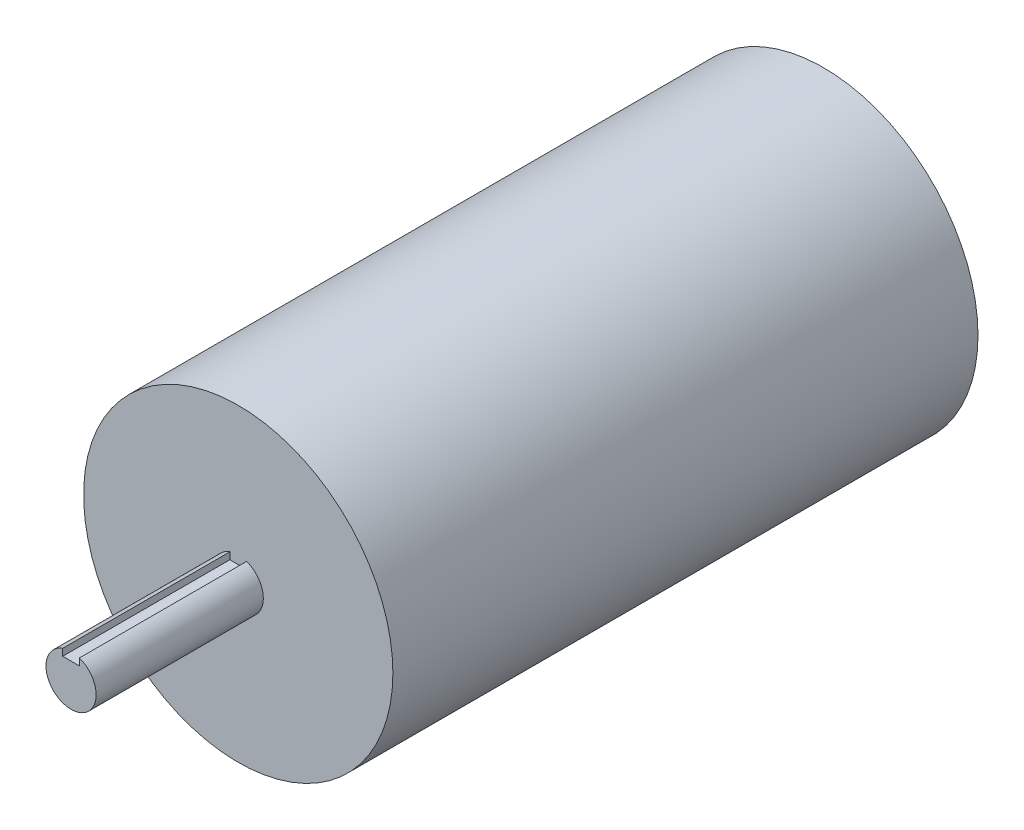
ISO-10303-21;
HEADER;
FILE_DESCRIPTION(('STEP AP214'),'2;1');
FILE_NAME('part.step','',(''),(''),'','','');
FILE_SCHEMA(('AUTOMOTIVE_DESIGN { 1 0 10303 214 1 1 1 1 }'));
ENDSEC;
DATA;
#1=APPLICATION_CONTEXT('core data for automotive mechanical design processes');
#2=APPLICATION_PROTOCOL_DEFINITION('international standard','automotive_design',2000,#1);
#3=PRODUCT_CONTEXT('',#1,'mechanical');
#4=PRODUCT('Part','Part','',(#3));
#5=PRODUCT_RELATED_PRODUCT_CATEGORY('part','',(#4));
#6=PRODUCT_DEFINITION_FORMATION('','',#4);
#7=PRODUCT_DEFINITION_CONTEXT('part definition',#1,'design');
#8=PRODUCT_DEFINITION('design','',#6,#7);
#9=PRODUCT_DEFINITION_SHAPE('','',#8);
#10=(LENGTH_UNIT() NAMED_UNIT(*) SI_UNIT(.MILLI.,.METRE.));
#11=(NAMED_UNIT(*) PLANE_ANGLE_UNIT() SI_UNIT($,.RADIAN.));
#12=(NAMED_UNIT(*) SI_UNIT($,.STERADIAN.) SOLID_ANGLE_UNIT());
#13=UNCERTAINTY_MEASURE_WITH_UNIT(LENGTH_MEASURE(1.E-05),#10,'distance_accuracy_value','');
#14=(GEOMETRIC_REPRESENTATION_CONTEXT(3) GLOBAL_UNCERTAINTY_ASSIGNED_CONTEXT((#13)) GLOBAL_UNIT_ASSIGNED_CONTEXT((#10,
#11,#12)) REPRESENTATION_CONTEXT('',''));
#15=CARTESIAN_POINT('',(0.,0.,0.));
#16=DIRECTION('',(0.,0.,1.));
#17=DIRECTION('',(1.,0.,0.));
#18=AXIS2_PLACEMENT_3D('',#15,#16,#17);
#19=CARTESIAN_POINT('',(0.,0.,35.));
#20=DIRECTION('',(0.,0.,-1.));
#21=DIRECTION('',(-1.,0.,0.));
#22=AXIS2_PLACEMENT_3D('',#19,#20,#21);
#23=CYLINDRICAL_SURFACE('',#22,18.5);
#24=CARTESIAN_POINT('',(0.,0.,35.));
#25=DIRECTION('',(0.,0.,1.));
#26=DIRECTION('',(1.,0.,0.));
#27=AXIS2_PLACEMENT_3D('',#24,#25,#26);
#28=CIRCLE('',#27,18.5);
#29=CARTESIAN_POINT('',(18.5,0.,35.));
#30=VERTEX_POINT('',#29);
#31=EDGE_CURVE('E11',#30,#30,#28,.T.);
#32=ORIENTED_EDGE('',*,*,#31,.F.);
#33=EDGE_LOOP('',(#32));
#34=FACE_BOUND('',#33,.T.);
#35=CARTESIAN_POINT('',(0.,0.,-35.));
#36=DIRECTION('',(0.,0.,1.));
#37=DIRECTION('',(1.,0.,0.));
#38=AXIS2_PLACEMENT_3D('',#35,#36,#37);
#39=CIRCLE('',#38,18.5);
#40=CARTESIAN_POINT('',(18.5,0.,-35.));
#41=VERTEX_POINT('',#40);
#42=EDGE_CURVE('E51',#41,#41,#39,.T.);
#43=ORIENTED_EDGE('',*,*,#42,.T.);
#44=EDGE_LOOP('',(#43));
#45=FACE_BOUND('',#44,.T.);
#46=ADVANCED_FACE('F50',(#34,#45),#23,.T.);
#47=CARTESIAN_POINT('',(0.,0.,35.));
#48=DIRECTION('',(0.,0.,1.));
#49=DIRECTION('',(1.,0.,0.));
#50=AXIS2_PLACEMENT_3D('',#47,#48,#49);
#51=PLANE('',#50);
#52=CARTESIAN_POINT('',(0.,0.,35.));
#53=DIRECTION('',(0.,0.,1.));
#54=DIRECTION('',(-1.,0.,0.));
#55=AXIS2_PLACEMENT_3D('',#52,#53,#54);
#56=CIRCLE('',#55,3.);
#57=CARTESIAN_POINT('',(-1.,2.82842712474619,35.));
#58=VERTEX_POINT('',#57);
#59=CARTESIAN_POINT('',(1.,2.82842712474619,35.));
#60=VERTEX_POINT('',#59);
#61=EDGE_CURVE('E65',#58,#60,#56,.T.);
#62=ORIENTED_EDGE('',*,*,#61,.F.);
#63=DIRECTION('',(0.,1.,0.));
#64=VECTOR('',#63,1.);
#65=CARTESIAN_POINT('',(-1.,2.82842712474619,35.));
#66=LINE('',#65,#64);
#67=CARTESIAN_POINT('',(-1.,2.,35.));
#68=VERTEX_POINT('',#67);
#69=EDGE_CURVE('E69',#68,#58,#66,.T.);
#70=ORIENTED_EDGE('',*,*,#69,.F.);
#71=DIRECTION('',(-1.,0.,0.));
#72=VECTOR('',#71,1.);
#73=CARTESIAN_POINT('',(-1.,2.,35.));
#74=LINE('',#73,#72);
#75=CARTESIAN_POINT('',(1.,2.,35.));
#76=VERTEX_POINT('',#75);
#77=EDGE_CURVE('E117',#76,#68,#74,.T.);
#78=ORIENTED_EDGE('',*,*,#77,.F.);
#79=DIRECTION('',(0.,-1.,0.));
#80=VECTOR('',#79,1.);
#81=CARTESIAN_POINT('',(1.,2.,35.));
#82=LINE('',#81,#80);
#83=EDGE_CURVE('E119',#60,#76,#82,.T.);
#84=ORIENTED_EDGE('',*,*,#83,.F.);
#85=EDGE_LOOP('',(#62,#70,#78,#84));
#86=FACE_BOUND('',#85,.T.);
#87=ORIENTED_EDGE('',*,*,#31,.T.);
#88=EDGE_LOOP('',(#87));
#89=FACE_BOUND('',#88,.T.);
#90=ADVANCED_FACE('F138',(#86,#89),#51,.T.);
#91=CARTESIAN_POINT('',(0.,0.,-35.));
#92=DIRECTION('',(0.,0.,1.));
#93=DIRECTION('',(1.,0.,0.));
#94=AXIS2_PLACEMENT_3D('',#91,#92,#93);
#95=PLANE('',#94);
#96=ORIENTED_EDGE('',*,*,#42,.F.);
#97=EDGE_LOOP('',(#96));
#98=FACE_BOUND('',#97,.T.);
#99=ADVANCED_FACE('F145',(#98),#95,.F.);
#100=CARTESIAN_POINT('',(0.,0.,55.));
#101=DIRECTION('',(0.,0.,-1.));
#102=DIRECTION('',(-1.,0.,0.));
#103=AXIS2_PLACEMENT_3D('',#100,#101,#102);
#104=CYLINDRICAL_SURFACE('',#103,3.);
#105=ORIENTED_EDGE('',*,*,#61,.T.);
#106=DIRECTION('',(0.,0.,-1.));
#107=VECTOR('',#106,1.);
#108=CARTESIAN_POINT('',(1.,2.82842712474619,55.));
#109=LINE('',#108,#107);
#110=CARTESIAN_POINT('',(1.,2.82842712474619,55.));
#111=VERTEX_POINT('',#110);
#112=EDGE_CURVE('E91',#111,#60,#109,.T.);
#113=ORIENTED_EDGE('',*,*,#112,.F.);
#114=CARTESIAN_POINT('',(0.,0.,55.));
#115=DIRECTION('',(0.,0.,1.));
#116=DIRECTION('',(-1.,0.,0.));
#117=AXIS2_PLACEMENT_3D('',#114,#115,#116);
#118=CIRCLE('',#117,3.);
#119=CARTESIAN_POINT('',(-1.,2.82842712474619,55.));
#120=VERTEX_POINT('',#119);
#121=EDGE_CURVE('E97',#120,#111,#118,.T.);
#122=ORIENTED_EDGE('',*,*,#121,.F.);
#123=DIRECTION('',(0.,0.,-1.));
#124=VECTOR('',#123,1.);
#125=CARTESIAN_POINT('',(-1.,2.82842712474619,55.));
#126=LINE('',#125,#124);
#127=EDGE_CURVE('E114',#120,#58,#126,.T.);
#128=ORIENTED_EDGE('',*,*,#127,.T.);
#129=EDGE_LOOP('',(#105,#113,#122,#128));
#130=FACE_BOUND('',#129,.T.);
#131=ADVANCED_FACE('F110',(#130),#104,.T.);
#132=CARTESIAN_POINT('',(1.,2.,55.));
#133=DIRECTION('',(1.,0.,0.));
#134=DIRECTION('',(0.,0.,-1.));
#135=AXIS2_PLACEMENT_3D('',#132,#133,#134);
#136=PLANE('',#135);
#137=ORIENTED_EDGE('',*,*,#83,.T.);
#138=DIRECTION('',(0.,0.,-1.));
#139=VECTOR('',#138,1.);
#140=CARTESIAN_POINT('',(1.,2.,55.));
#141=LINE('',#140,#139);
#142=CARTESIAN_POINT('',(1.,2.,55.));
#143=VERTEX_POINT('',#142);
#144=EDGE_CURVE('E93',#143,#76,#141,.T.);
#145=ORIENTED_EDGE('',*,*,#144,.F.);
#146=DIRECTION('',(0.,-1.,0.));
#147=VECTOR('',#146,1.);
#148=CARTESIAN_POINT('',(1.,2.,55.));
#149=LINE('',#148,#147);
#150=EDGE_CURVE('E89',#111,#143,#149,.T.);
#151=ORIENTED_EDGE('',*,*,#150,.F.);
#152=ORIENTED_EDGE('',*,*,#112,.T.);
#153=EDGE_LOOP('',(#137,#145,#151,#152));
#154=FACE_BOUND('',#153,.T.);
#155=ADVANCED_FACE('F88',(#154),#136,.F.);
#156=CARTESIAN_POINT('',(-1.,2.,55.));
#157=DIRECTION('',(0.,-1.,0.));
#158=DIRECTION('',(0.,0.,-1.));
#159=AXIS2_PLACEMENT_3D('',#156,#157,#158);
#160=PLANE('',#159);
#161=ORIENTED_EDGE('',*,*,#77,.T.);
#162=DIRECTION('',(0.,0.,-1.));
#163=VECTOR('',#162,1.);
#164=CARTESIAN_POINT('',(-1.,2.,55.));
#165=LINE('',#164,#163);
#166=CARTESIAN_POINT('',(-1.,2.,55.));
#167=VERTEX_POINT('',#166);
#168=EDGE_CURVE('E109',#167,#68,#165,.T.);
#169=ORIENTED_EDGE('',*,*,#168,.F.);
#170=DIRECTION('',(-1.,0.,0.));
#171=VECTOR('',#170,1.);
#172=CARTESIAN_POINT('',(-1.,2.,55.));
#173=LINE('',#172,#171);
#174=EDGE_CURVE('E98',#143,#167,#173,.T.);
#175=ORIENTED_EDGE('',*,*,#174,.F.);
#176=ORIENTED_EDGE('',*,*,#144,.T.);
#177=EDGE_LOOP('',(#161,#169,#175,#176));
#178=FACE_BOUND('',#177,.T.);
#179=ADVANCED_FACE('F127',(#178),#160,.F.);
#180=CARTESIAN_POINT('',(-1.,2.82842712474619,55.));
#181=DIRECTION('',(-1.,0.,0.));
#182=DIRECTION('',(0.,0.,1.));
#183=AXIS2_PLACEMENT_3D('',#180,#181,#182);
#184=PLANE('',#183);
#185=ORIENTED_EDGE('',*,*,#69,.T.);
#186=ORIENTED_EDGE('',*,*,#127,.F.);
#187=DIRECTION('',(0.,1.,0.));
#188=VECTOR('',#187,1.);
#189=CARTESIAN_POINT('',(-1.,2.82842712474619,55.));
#190=LINE('',#189,#188);
#191=EDGE_CURVE('E105',#167,#120,#190,.T.);
#192=ORIENTED_EDGE('',*,*,#191,.F.);
#193=ORIENTED_EDGE('',*,*,#168,.T.);
#194=EDGE_LOOP('',(#185,#186,#192,#193));
#195=FACE_BOUND('',#194,.T.);
#196=ADVANCED_FACE('F129',(#195),#184,.F.);
#197=CARTESIAN_POINT('',(0.,0.,55.));
#198=DIRECTION('',(0.,0.,-1.));
#199=DIRECTION('',(-1.,0.,0.));
#200=AXIS2_PLACEMENT_3D('',#197,#198,#199);
#201=PLANE('',#200);
#202=ORIENTED_EDGE('',*,*,#121,.T.);
#203=ORIENTED_EDGE('',*,*,#150,.T.);
#204=ORIENTED_EDGE('',*,*,#174,.T.);
#205=ORIENTED_EDGE('',*,*,#191,.T.);
#206=EDGE_LOOP('',(#202,#203,#204,#205));
#207=FACE_BOUND('',#206,.T.);
#208=ADVANCED_FACE('F99',(#207),#201,.F.);
#209=CLOSED_SHELL('',(#46,#90,#99,#131,#155,#179,#196,#208));
#210=MANIFOLD_SOLID_BREP('B2',#209);
#211=ADVANCED_BREP_SHAPE_REPRESENTATION('',(#18,#210),#14);
#212=SHAPE_DEFINITION_REPRESENTATION(#9,#211);
ENDSEC;
END-ISO-10303-21;
